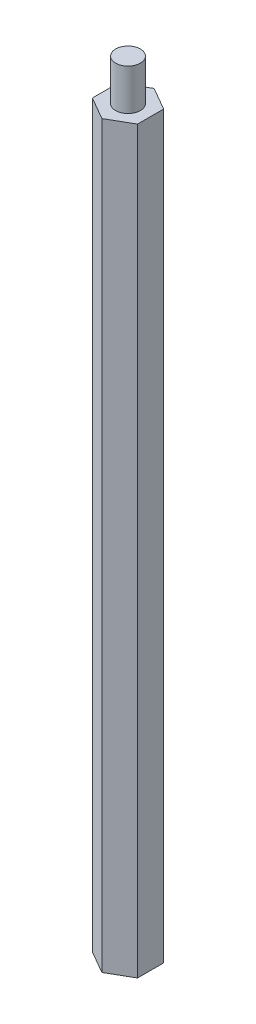
ISO-10303-21;
HEADER;
FILE_DESCRIPTION(('STEP AP214'),'2;1');
FILE_NAME('part.step','',(''),(''),'','','');
FILE_SCHEMA(('AUTOMOTIVE_DESIGN { 1 0 10303 214 1 1 1 1 }'));
ENDSEC;
DATA;
#1=APPLICATION_CONTEXT('core data for automotive mechanical design processes');
#2=APPLICATION_PROTOCOL_DEFINITION('international standard','automotive_design',2000,#1);
#3=PRODUCT_CONTEXT('',#1,'mechanical');
#4=PRODUCT('Part','Part','',(#3));
#5=PRODUCT_RELATED_PRODUCT_CATEGORY('part','',(#4));
#6=PRODUCT_DEFINITION_FORMATION('','',#4);
#7=PRODUCT_DEFINITION_CONTEXT('part definition',#1,'design');
#8=PRODUCT_DEFINITION('design','',#6,#7);
#9=PRODUCT_DEFINITION_SHAPE('','',#8);
#10=(LENGTH_UNIT() NAMED_UNIT(*) SI_UNIT(.MILLI.,.METRE.));
#11=(NAMED_UNIT(*) PLANE_ANGLE_UNIT() SI_UNIT($,.RADIAN.));
#12=(NAMED_UNIT(*) SI_UNIT($,.STERADIAN.) SOLID_ANGLE_UNIT());
#13=UNCERTAINTY_MEASURE_WITH_UNIT(LENGTH_MEASURE(1.E-05),#10,'distance_accuracy_value','');
#14=(GEOMETRIC_REPRESENTATION_CONTEXT(3) GLOBAL_UNCERTAINTY_ASSIGNED_CONTEXT((#13)) GLOBAL_UNIT_ASSIGNED_CONTEXT((#10,
#11,#12)) REPRESENTATION_CONTEXT('',''));
#15=CARTESIAN_POINT('',(0.,0.,0.));
#16=DIRECTION('',(0.,0.,1.));
#17=DIRECTION('',(1.,0.,0.));
#18=AXIS2_PLACEMENT_3D('',#15,#16,#17);
#19=CARTESIAN_POINT('',(2.74999999999998,90.,-1.5877132402715));
#20=DIRECTION('',(-0.499999999999995,0.,0.866025403784442));
#21=DIRECTION('',(0.866025403784442,0.,0.499999999999995));
#22=AXIS2_PLACEMENT_3D('',#19,#20,#21);
#23=PLANE('',#22);
#24=DIRECTION('',(-0.866025403784442,0.,-0.499999999999995));
#25=VECTOR('',#24,1.);
#26=CARTESIAN_POINT('',(2.74999999999998,0.,-1.5877132402715));
#27=LINE('',#26,#25);
#28=CARTESIAN_POINT('',(2.74999999999998,0.,-1.5877132402715));
#29=VERTEX_POINT('',#28);
#30=CARTESIAN_POINT('',(0.,0.,-3.17542648054294));
#31=VERTEX_POINT('',#30);
#32=EDGE_CURVE('E123',#29,#31,#27,.T.);
#33=ORIENTED_EDGE('',*,*,#32,.T.);
#34=DIRECTION('',(0.,-1.,0.));
#35=VECTOR('',#34,1.);
#36=CARTESIAN_POINT('',(0.,90.,-3.17542648054294));
#37=LINE('',#36,#35);
#38=CARTESIAN_POINT('',(0.,90.,-3.17542648054294));
#39=VERTEX_POINT('',#38);
#40=EDGE_CURVE('E40',#39,#31,#37,.T.);
#41=ORIENTED_EDGE('',*,*,#40,.F.);
#42=DIRECTION('',(-0.866025403784442,0.,-0.499999999999995));
#43=VECTOR('',#42,1.);
#44=CARTESIAN_POINT('',(2.74999999999998,90.,-1.5877132402715));
#45=LINE('',#44,#43);
#46=CARTESIAN_POINT('',(2.74999999999998,90.,-1.5877132402715));
#47=VERTEX_POINT('',#46);
#48=EDGE_CURVE('E134',#47,#39,#45,.T.);
#49=ORIENTED_EDGE('',*,*,#48,.F.);
#50=DIRECTION('',(0.,-1.,0.));
#51=VECTOR('',#50,1.);
#52=CARTESIAN_POINT('',(2.74999999999998,90.,-1.5877132402715));
#53=LINE('',#52,#51);
#54=EDGE_CURVE('E119',#47,#29,#53,.T.);
#55=ORIENTED_EDGE('',*,*,#54,.T.);
#56=EDGE_LOOP('',(#33,#41,#49,#55));
#57=FACE_BOUND('',#56,.T.);
#58=ADVANCED_FACE('F37',(#57),#23,.F.);
#59=CARTESIAN_POINT('',(0.,90.,-3.17542648054294));
#60=DIRECTION('',(0.500000000000001,0.,0.866025403784438));
#61=DIRECTION('',(0.866025403784438,0.,-0.500000000000001));
#62=AXIS2_PLACEMENT_3D('',#59,#60,#61);
#63=PLANE('',#62);
#64=DIRECTION('',(-0.866025403784438,0.,0.500000000000001));
#65=VECTOR('',#64,1.);
#66=CARTESIAN_POINT('',(0.,0.,-3.17542648054294));
#67=LINE('',#66,#65);
#68=CARTESIAN_POINT('',(-2.75,0.,-1.58771324027146));
#69=VERTEX_POINT('',#68);
#70=EDGE_CURVE('E126',#31,#69,#67,.T.);
#71=ORIENTED_EDGE('',*,*,#70,.T.);
#72=DIRECTION('',(0.,-1.,0.));
#73=VECTOR('',#72,1.);
#74=CARTESIAN_POINT('',(-2.75,90.,-1.58771324027146));
#75=LINE('',#74,#73);
#76=CARTESIAN_POINT('',(-2.75,90.,-1.58771324027146));
#77=VERTEX_POINT('',#76);
#78=EDGE_CURVE('E137',#77,#69,#75,.T.);
#79=ORIENTED_EDGE('',*,*,#78,.F.);
#80=DIRECTION('',(-0.866025403784438,0.,0.500000000000001));
#81=VECTOR('',#80,1.);
#82=CARTESIAN_POINT('',(0.,90.,-3.17542648054294));
#83=LINE('',#82,#81);
#84=EDGE_CURVE('E92',#39,#77,#83,.T.);
#85=ORIENTED_EDGE('',*,*,#84,.F.);
#86=ORIENTED_EDGE('',*,*,#40,.T.);
#87=EDGE_LOOP('',(#71,#79,#85,#86));
#88=FACE_BOUND('',#87,.T.);
#89=ADVANCED_FACE('F142',(#88),#63,.F.);
#90=CARTESIAN_POINT('',(-2.75,90.,-1.58771324027146));
#91=DIRECTION('',(1.,0.,0.));
#92=DIRECTION('',(0.,0.,-1.));
#93=AXIS2_PLACEMENT_3D('',#90,#91,#92);
#94=PLANE('',#93);
#95=DIRECTION('',(0.,0.,1.));
#96=VECTOR('',#95,1.);
#97=CARTESIAN_POINT('',(-2.75,0.,-1.58771324027146));
#98=LINE('',#97,#96);
#99=CARTESIAN_POINT('',(-2.74999999999999,0.,1.58771324027148));
#100=VERTEX_POINT('',#99);
#101=EDGE_CURVE('E129',#69,#100,#98,.T.);
#102=ORIENTED_EDGE('',*,*,#101,.T.);
#103=DIRECTION('',(0.,-1.,0.));
#104=VECTOR('',#103,1.);
#105=CARTESIAN_POINT('',(-2.74999999999999,90.,1.58771324027148));
#106=LINE('',#105,#104);
#107=CARTESIAN_POINT('',(-2.74999999999999,90.,1.58771324027148));
#108=VERTEX_POINT('',#107);
#109=EDGE_CURVE('E114',#108,#100,#106,.T.);
#110=ORIENTED_EDGE('',*,*,#109,.F.);
#111=DIRECTION('',(0.,0.,1.));
#112=VECTOR('',#111,1.);
#113=CARTESIAN_POINT('',(-2.75,90.,-1.58771324027146));
#114=LINE('',#113,#112);
#115=EDGE_CURVE('E105',#77,#108,#114,.T.);
#116=ORIENTED_EDGE('',*,*,#115,.F.);
#117=ORIENTED_EDGE('',*,*,#78,.T.);
#118=EDGE_LOOP('',(#102,#110,#116,#117));
#119=FACE_BOUND('',#118,.T.);
#120=ADVANCED_FACE('F148',(#119),#94,.F.);
#121=CARTESIAN_POINT('',(-2.74999999999999,90.,1.58771324027148));
#122=DIRECTION('',(0.499999999999995,0.,-0.866025403784441));
#123=DIRECTION('',(-0.866025403784442,0.,-0.499999999999995));
#124=AXIS2_PLACEMENT_3D('',#121,#122,#123);
#125=PLANE('',#124);
#126=DIRECTION('',(0.866025403784441,0.,0.499999999999995));
#127=VECTOR('',#126,1.);
#128=CARTESIAN_POINT('',(-2.74999999999999,0.,1.58771324027148));
#129=LINE('',#128,#127);
#130=CARTESIAN_POINT('',(0.,0.,3.17542648054294));
#131=VERTEX_POINT('',#130);
#132=EDGE_CURVE('E113',#100,#131,#129,.T.);
#133=ORIENTED_EDGE('',*,*,#132,.T.);
#134=DIRECTION('',(0.,-1.,0.));
#135=VECTOR('',#134,1.);
#136=CARTESIAN_POINT('',(0.,90.,3.17542648054294));
#137=LINE('',#136,#135);
#138=CARTESIAN_POINT('',(0.,90.,3.17542648054294));
#139=VERTEX_POINT('',#138);
#140=EDGE_CURVE('E110',#139,#131,#137,.T.);
#141=ORIENTED_EDGE('',*,*,#140,.F.);
#142=DIRECTION('',(0.866025403784441,0.,0.499999999999995));
#143=VECTOR('',#142,1.);
#144=CARTESIAN_POINT('',(-2.74999999999999,90.,1.58771324027148));
#145=LINE('',#144,#143);
#146=EDGE_CURVE('E99',#108,#139,#145,.T.);
#147=ORIENTED_EDGE('',*,*,#146,.F.);
#148=ORIENTED_EDGE('',*,*,#109,.T.);
#149=EDGE_LOOP('',(#133,#141,#147,#148));
#150=FACE_BOUND('',#149,.T.);
#151=ADVANCED_FACE('F111',(#150),#125,.F.);
#152=CARTESIAN_POINT('',(0.,90.,3.17542648054294));
#153=DIRECTION('',(-0.500000000000007,0.,-0.866025403784435));
#154=DIRECTION('',(-0.866025403784435,0.,0.500000000000007));
#155=AXIS2_PLACEMENT_3D('',#152,#153,#154);
#156=PLANE('',#155);
#157=DIRECTION('',(0.866025403784434,0.,-0.500000000000007));
#158=VECTOR('',#157,1.);
#159=CARTESIAN_POINT('',(0.,0.,3.17542648054294));
#160=LINE('',#159,#158);
#161=CARTESIAN_POINT('',(2.75000000000001,0.,1.58771324027144));
#162=VERTEX_POINT('',#161);
#163=EDGE_CURVE('E77',#131,#162,#160,.T.);
#164=ORIENTED_EDGE('',*,*,#163,.T.);
#165=DIRECTION('',(0.,-1.,0.));
#166=VECTOR('',#165,1.);
#167=CARTESIAN_POINT('',(2.75000000000001,90.,1.58771324027144));
#168=LINE('',#167,#166);
#169=CARTESIAN_POINT('',(2.75000000000001,90.,1.58771324027144));
#170=VERTEX_POINT('',#169);
#171=EDGE_CURVE('E115',#170,#162,#168,.T.);
#172=ORIENTED_EDGE('',*,*,#171,.F.);
#173=DIRECTION('',(0.866025403784434,0.,-0.500000000000007));
#174=VECTOR('',#173,1.);
#175=CARTESIAN_POINT('',(0.,90.,3.17542648054294));
#176=LINE('',#175,#174);
#177=EDGE_CURVE('E103',#139,#170,#176,.T.);
#178=ORIENTED_EDGE('',*,*,#177,.F.);
#179=ORIENTED_EDGE('',*,*,#140,.T.);
#180=EDGE_LOOP('',(#164,#172,#178,#179));
#181=FACE_BOUND('',#180,.T.);
#182=ADVANCED_FACE('F117',(#181),#156,.F.);
#183=CARTESIAN_POINT('',(2.75000000000001,90.,1.58771324027144));
#184=DIRECTION('',(-1.,0.,0.));
#185=DIRECTION('',(0.,0.,1.));
#186=AXIS2_PLACEMENT_3D('',#183,#184,#185);
#187=PLANE('',#186);
#188=DIRECTION('',(0.,0.,-1.));
#189=VECTOR('',#188,1.);
#190=CARTESIAN_POINT('',(2.75000000000001,0.,1.58771324027144));
#191=LINE('',#190,#189);
#192=EDGE_CURVE('E83',#162,#29,#191,.T.);
#193=ORIENTED_EDGE('',*,*,#192,.T.);
#194=ORIENTED_EDGE('',*,*,#54,.F.);
#195=DIRECTION('',(0.,0.,-1.));
#196=VECTOR('',#195,1.);
#197=CARTESIAN_POINT('',(2.75000000000001,90.,1.58771324027144));
#198=LINE('',#197,#196);
#199=EDGE_CURVE('E54',#170,#47,#198,.T.);
#200=ORIENTED_EDGE('',*,*,#199,.F.);
#201=ORIENTED_EDGE('',*,*,#171,.T.);
#202=EDGE_LOOP('',(#193,#194,#200,#201));
#203=FACE_BOUND('',#202,.T.);
#204=ADVANCED_FACE('F164',(#203),#187,.F.);
#205=CARTESIAN_POINT('',(0.,90.,0.));
#206=DIRECTION('',(0.,1.,0.));
#207=DIRECTION('',(0.,0.,1.));
#208=AXIS2_PLACEMENT_3D('',#205,#206,#207);
#209=PLANE('',#208);
#210=CARTESIAN_POINT('',(0.,90.,0.));
#211=DIRECTION('',(0.,1.,0.));
#212=DIRECTION('',(0.,0.,1.));
#213=AXIS2_PLACEMENT_3D('',#210,#211,#212);
#214=CIRCLE('',#213,1.5);
#215=CARTESIAN_POINT('',(0.,90.,1.5));
#216=VERTEX_POINT('',#215);
#217=EDGE_CURVE('E11',#216,#216,#214,.T.);
#218=ORIENTED_EDGE('',*,*,#217,.F.);
#219=EDGE_LOOP('',(#218));
#220=FACE_BOUND('',#219,.T.);
#221=ORIENTED_EDGE('',*,*,#48,.T.);
#222=ORIENTED_EDGE('',*,*,#84,.T.);
#223=ORIENTED_EDGE('',*,*,#115,.T.);
#224=ORIENTED_EDGE('',*,*,#146,.T.);
#225=ORIENTED_EDGE('',*,*,#177,.T.);
#226=ORIENTED_EDGE('',*,*,#199,.T.);
#227=EDGE_LOOP('',(#221,#222,#223,#224,#225,#226));
#228=FACE_BOUND('',#227,.T.);
#229=ADVANCED_FACE('F101',(#220,#228),#209,.T.);
#230=CARTESIAN_POINT('',(0.,0.,0.));
#231=DIRECTION('',(0.,1.,0.));
#232=DIRECTION('',(0.,0.,1.));
#233=AXIS2_PLACEMENT_3D('',#230,#231,#232);
#234=PLANE('',#233);
#235=ORIENTED_EDGE('',*,*,#32,.F.);
#236=ORIENTED_EDGE('',*,*,#192,.F.);
#237=ORIENTED_EDGE('',*,*,#163,.F.);
#238=ORIENTED_EDGE('',*,*,#132,.F.);
#239=ORIENTED_EDGE('',*,*,#101,.F.);
#240=ORIENTED_EDGE('',*,*,#70,.F.);
#241=EDGE_LOOP('',(#235,#236,#237,#238,#239,#240));
#242=FACE_BOUND('',#241,.T.);
#243=ADVANCED_FACE('F147',(#242),#234,.F.);
#244=CARTESIAN_POINT('',(0.,95.,0.));
#245=DIRECTION('',(0.,-1.,0.));
#246=DIRECTION('',(0.,0.,-1.));
#247=AXIS2_PLACEMENT_3D('',#244,#245,#246);
#248=CYLINDRICAL_SURFACE('',#247,1.5);
#249=CARTESIAN_POINT('',(0.,95.,0.));
#250=DIRECTION('',(0.,1.,0.));
#251=DIRECTION('',(0.,0.,1.));
#252=AXIS2_PLACEMENT_3D('',#249,#250,#251);
#253=CIRCLE('',#252,1.5);
#254=CARTESIAN_POINT('',(0.,95.,1.5));
#255=VERTEX_POINT('',#254);
#256=EDGE_CURVE('E127',#255,#255,#253,.T.);
#257=ORIENTED_EDGE('',*,*,#256,.F.);
#258=EDGE_LOOP('',(#257));
#259=FACE_BOUND('',#258,.T.);
#260=ORIENTED_EDGE('',*,*,#217,.T.);
#261=EDGE_LOOP('',(#260));
#262=FACE_BOUND('',#261,.T.);
#263=ADVANCED_FACE('F157',(#259,#262),#248,.T.);
#264=CARTESIAN_POINT('',(0.,95.,0.));
#265=DIRECTION('',(0.,1.,0.));
#266=DIRECTION('',(0.,0.,1.));
#267=AXIS2_PLACEMENT_3D('',#264,#265,#266);
#268=PLANE('',#267);
#269=ORIENTED_EDGE('',*,*,#256,.T.);
#270=EDGE_LOOP('',(#269));
#271=FACE_BOUND('',#270,.T.);
#272=ADVANCED_FACE('F155',(#271),#268,.T.);
#273=CLOSED_SHELL('',(#58,#89,#120,#151,#182,#204,#229,#243,#263,#272));
#274=MANIFOLD_SOLID_BREP('B2',#273);
#275=ADVANCED_BREP_SHAPE_REPRESENTATION('',(#18,#274),#14);
#276=SHAPE_DEFINITION_REPRESENTATION(#9,#275);
ENDSEC;
END-ISO-10303-21;
